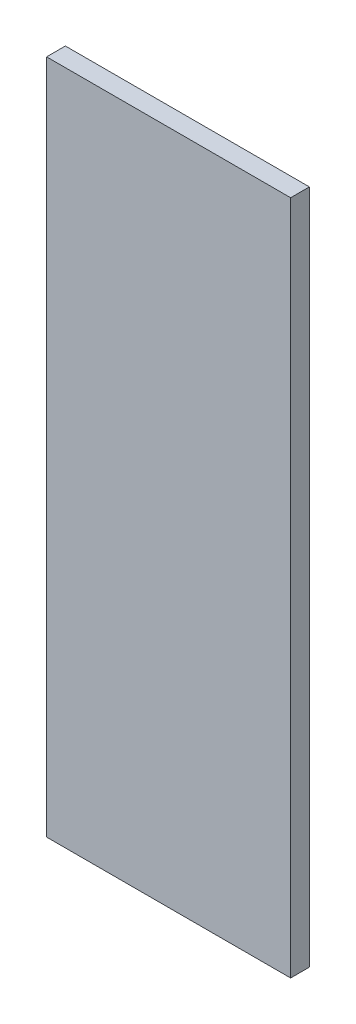
ISO-10303-21;
HEADER;
FILE_DESCRIPTION(('STEP AP214'),'2;1');
FILE_NAME('part.step','',(''),(''),'','','');
FILE_SCHEMA(('AUTOMOTIVE_DESIGN { 1 0 10303 214 1 1 1 1 }'));
ENDSEC;
DATA;
#1=APPLICATION_CONTEXT('core data for automotive mechanical design processes');
#2=APPLICATION_PROTOCOL_DEFINITION('international standard','automotive_design',2000,#1);
#3=PRODUCT_CONTEXT('',#1,'mechanical');
#4=PRODUCT('Part','Part','',(#3));
#5=PRODUCT_RELATED_PRODUCT_CATEGORY('part','',(#4));
#6=PRODUCT_DEFINITION_FORMATION('','',#4);
#7=PRODUCT_DEFINITION_CONTEXT('part definition',#1,'design');
#8=PRODUCT_DEFINITION('design','',#6,#7);
#9=PRODUCT_DEFINITION_SHAPE('','',#8);
#10=(LENGTH_UNIT() NAMED_UNIT(*) SI_UNIT(.MILLI.,.METRE.));
#11=(NAMED_UNIT(*) PLANE_ANGLE_UNIT() SI_UNIT($,.RADIAN.));
#12=(NAMED_UNIT(*) SI_UNIT($,.STERADIAN.) SOLID_ANGLE_UNIT());
#13=UNCERTAINTY_MEASURE_WITH_UNIT(LENGTH_MEASURE(1.E-05),#10,'distance_accuracy_value','');
#14=(GEOMETRIC_REPRESENTATION_CONTEXT(3) GLOBAL_UNCERTAINTY_ASSIGNED_CONTEXT((#13)) GLOBAL_UNIT_ASSIGNED_CONTEXT((#10,
#11,#12)) REPRESENTATION_CONTEXT('',''));
#15=CARTESIAN_POINT('',(0.,0.,0.));
#16=DIRECTION('',(0.,0.,1.));
#17=DIRECTION('',(1.,0.,0.));
#18=AXIS2_PLACEMENT_3D('',#15,#16,#17);
#19=CARTESIAN_POINT('',(-309.640807174888,187.082959641256,12.7));
#20=DIRECTION('',(1.,0.,0.));
#21=DIRECTION('',(0.,1.,0.));
#22=AXIS2_PLACEMENT_3D('',#19,#20,#21);
#23=PLANE('',#22);
#24=DIRECTION('',(0.,-1.,0.));
#25=VECTOR('',#24,1.);
#26=CARTESIAN_POINT('',(-309.640807174888,187.082959641256,0.));
#27=LINE('',#26,#25);
#28=CARTESIAN_POINT('',(-309.640807174888,187.082959641256,0.));
#29=VERTEX_POINT('',#28);
#30=CARTESIAN_POINT('',(-309.640807174888,-270.117040358745,0.));
#31=VERTEX_POINT('',#30);
#32=EDGE_CURVE('E99',#29,#31,#27,.T.);
#33=ORIENTED_EDGE('',*,*,#32,.T.);
#34=DIRECTION('',(0.,0.,-1.));
#35=VECTOR('',#34,1.);
#36=CARTESIAN_POINT('',(-309.640807174888,-270.117040358745,12.7));
#37=LINE('',#36,#35);
#38=CARTESIAN_POINT('',(-309.640807174888,-270.117040358745,12.7));
#39=VERTEX_POINT('',#38);
#40=EDGE_CURVE('E11',#39,#31,#37,.T.);
#41=ORIENTED_EDGE('',*,*,#40,.F.);
#42=DIRECTION('',(0.,-1.,0.));
#43=VECTOR('',#42,1.);
#44=CARTESIAN_POINT('',(-309.640807174888,187.082959641256,12.7));
#45=LINE('',#44,#43);
#46=CARTESIAN_POINT('',(-309.640807174888,187.082959641256,12.7));
#47=VERTEX_POINT('',#46);
#48=EDGE_CURVE('E87',#47,#39,#45,.T.);
#49=ORIENTED_EDGE('',*,*,#48,.F.);
#50=DIRECTION('',(0.,0.,-1.));
#51=VECTOR('',#50,1.);
#52=CARTESIAN_POINT('',(-309.640807174888,187.082959641256,12.7));
#53=LINE('',#52,#51);
#54=EDGE_CURVE('E95',#47,#29,#53,.T.);
#55=ORIENTED_EDGE('',*,*,#54,.T.);
#56=EDGE_LOOP('',(#33,#41,#49,#55));
#57=FACE_BOUND('',#56,.T.);
#58=ADVANCED_FACE('F36',(#57),#23,.F.);
#59=CARTESIAN_POINT('',(-309.640807174888,-270.117040358745,12.7));
#60=DIRECTION('',(0.,1.,0.));
#61=DIRECTION('',(-1.,0.,0.));
#62=AXIS2_PLACEMENT_3D('',#59,#60,#61);
#63=PLANE('',#62);
#64=DIRECTION('',(1.,0.,0.));
#65=VECTOR('',#64,1.);
#66=CARTESIAN_POINT('',(-309.640807174888,-270.117040358745,0.));
#67=LINE('',#66,#65);
#68=CARTESIAN_POINT('',(-144.540807174888,-270.117040358744,0.));
#69=VERTEX_POINT('',#68);
#70=EDGE_CURVE('E91',#31,#69,#67,.T.);
#71=ORIENTED_EDGE('',*,*,#70,.T.);
#72=DIRECTION('',(0.,0.,-1.));
#73=VECTOR('',#72,1.);
#74=CARTESIAN_POINT('',(-144.540807174888,-270.117040358744,12.7));
#75=LINE('',#74,#73);
#76=CARTESIAN_POINT('',(-144.540807174888,-270.117040358744,12.7));
#77=VERTEX_POINT('',#76);
#78=EDGE_CURVE('E44',#77,#69,#75,.T.);
#79=ORIENTED_EDGE('',*,*,#78,.F.);
#80=DIRECTION('',(1.,0.,0.));
#81=VECTOR('',#80,1.);
#82=CARTESIAN_POINT('',(-309.640807174888,-270.117040358745,12.7));
#83=LINE('',#82,#81);
#84=EDGE_CURVE('E82',#39,#77,#83,.T.);
#85=ORIENTED_EDGE('',*,*,#84,.F.);
#86=ORIENTED_EDGE('',*,*,#40,.T.);
#87=EDGE_LOOP('',(#71,#79,#85,#86));
#88=FACE_BOUND('',#87,.T.);
#89=ADVANCED_FACE('F90',(#88),#63,.F.);
#90=CARTESIAN_POINT('',(-144.540807174888,187.082959641256,12.7));
#91=DIRECTION('',(-1.,0.,0.));
#92=DIRECTION('',(0.,0.,1.));
#93=AXIS2_PLACEMENT_3D('',#90,#91,#92);
#94=PLANE('',#93);
#95=DIRECTION('',(0.,1.,0.));
#96=VECTOR('',#95,1.);
#97=CARTESIAN_POINT('',(-144.540807174888,187.082959641256,0.));
#98=LINE('',#97,#96);
#99=CARTESIAN_POINT('',(-144.540807174888,187.082959641256,0.));
#100=VERTEX_POINT('',#99);
#101=EDGE_CURVE('E69',#69,#100,#98,.T.);
#102=ORIENTED_EDGE('',*,*,#101,.T.);
#103=DIRECTION('',(0.,0.,-1.));
#104=VECTOR('',#103,1.);
#105=CARTESIAN_POINT('',(-144.540807174888,187.082959641256,12.7));
#106=LINE('',#105,#104);
#107=CARTESIAN_POINT('',(-144.540807174888,187.082959641256,12.7));
#108=VERTEX_POINT('',#107);
#109=EDGE_CURVE('E92',#108,#100,#106,.T.);
#110=ORIENTED_EDGE('',*,*,#109,.F.);
#111=DIRECTION('',(0.,1.,0.));
#112=VECTOR('',#111,1.);
#113=CARTESIAN_POINT('',(-144.540807174888,187.082959641256,12.7));
#114=LINE('',#113,#112);
#115=EDGE_CURVE('E85',#77,#108,#114,.T.);
#116=ORIENTED_EDGE('',*,*,#115,.F.);
#117=ORIENTED_EDGE('',*,*,#78,.T.);
#118=EDGE_LOOP('',(#102,#110,#116,#117));
#119=FACE_BOUND('',#118,.T.);
#120=ADVANCED_FACE('F93',(#119),#94,.F.);
#121=CARTESIAN_POINT('',(-309.640807174888,187.082959641256,12.7));
#122=DIRECTION('',(0.,-1.,0.));
#123=DIRECTION('',(0.,0.,-1.));
#124=AXIS2_PLACEMENT_3D('',#121,#122,#123);
#125=PLANE('',#124);
#126=DIRECTION('',(-1.,0.,0.));
#127=VECTOR('',#126,1.);
#128=CARTESIAN_POINT('',(-309.640807174888,187.082959641256,0.));
#129=LINE('',#128,#127);
#130=EDGE_CURVE('E75',#100,#29,#129,.T.);
#131=ORIENTED_EDGE('',*,*,#130,.T.);
#132=ORIENTED_EDGE('',*,*,#54,.F.);
#133=DIRECTION('',(-1.,0.,0.));
#134=VECTOR('',#133,1.);
#135=CARTESIAN_POINT('',(-309.640807174888,187.082959641256,12.7));
#136=LINE('',#135,#134);
#137=EDGE_CURVE('E52',#108,#47,#136,.T.);
#138=ORIENTED_EDGE('',*,*,#137,.F.);
#139=ORIENTED_EDGE('',*,*,#109,.T.);
#140=EDGE_LOOP('',(#131,#132,#138,#139));
#141=FACE_BOUND('',#140,.T.);
#142=ADVANCED_FACE('F106',(#141),#125,.F.);
#143=CARTESIAN_POINT('',(0.,0.,12.7));
#144=DIRECTION('',(0.,0.,1.));
#145=DIRECTION('',(1.,0.,0.));
#146=AXIS2_PLACEMENT_3D('',#143,#144,#145);
#147=PLANE('',#146);
#148=ORIENTED_EDGE('',*,*,#48,.T.);
#149=ORIENTED_EDGE('',*,*,#84,.T.);
#150=ORIENTED_EDGE('',*,*,#115,.T.);
#151=ORIENTED_EDGE('',*,*,#137,.T.);
#152=EDGE_LOOP('',(#148,#149,#150,#151));
#153=FACE_BOUND('',#152,.T.);
#154=ADVANCED_FACE('F83',(#153),#147,.T.);
#155=CARTESIAN_POINT('',(0.,0.,0.));
#156=DIRECTION('',(0.,0.,1.));
#157=DIRECTION('',(1.,0.,0.));
#158=AXIS2_PLACEMENT_3D('',#155,#156,#157);
#159=PLANE('',#158);
#160=ORIENTED_EDGE('',*,*,#32,.F.);
#161=ORIENTED_EDGE('',*,*,#130,.F.);
#162=ORIENTED_EDGE('',*,*,#101,.F.);
#163=ORIENTED_EDGE('',*,*,#70,.F.);
#164=EDGE_LOOP('',(#160,#161,#162,#163));
#165=FACE_BOUND('',#164,.T.);
#166=ADVANCED_FACE('F109',(#165),#159,.F.);
#167=CLOSED_SHELL('',(#58,#89,#120,#142,#154,#166));
#168=MANIFOLD_SOLID_BREP('B2',#167);
#169=ADVANCED_BREP_SHAPE_REPRESENTATION('',(#18,#168),#14);
#170=SHAPE_DEFINITION_REPRESENTATION(#9,#169);
ENDSEC;
END-ISO-10303-21;
